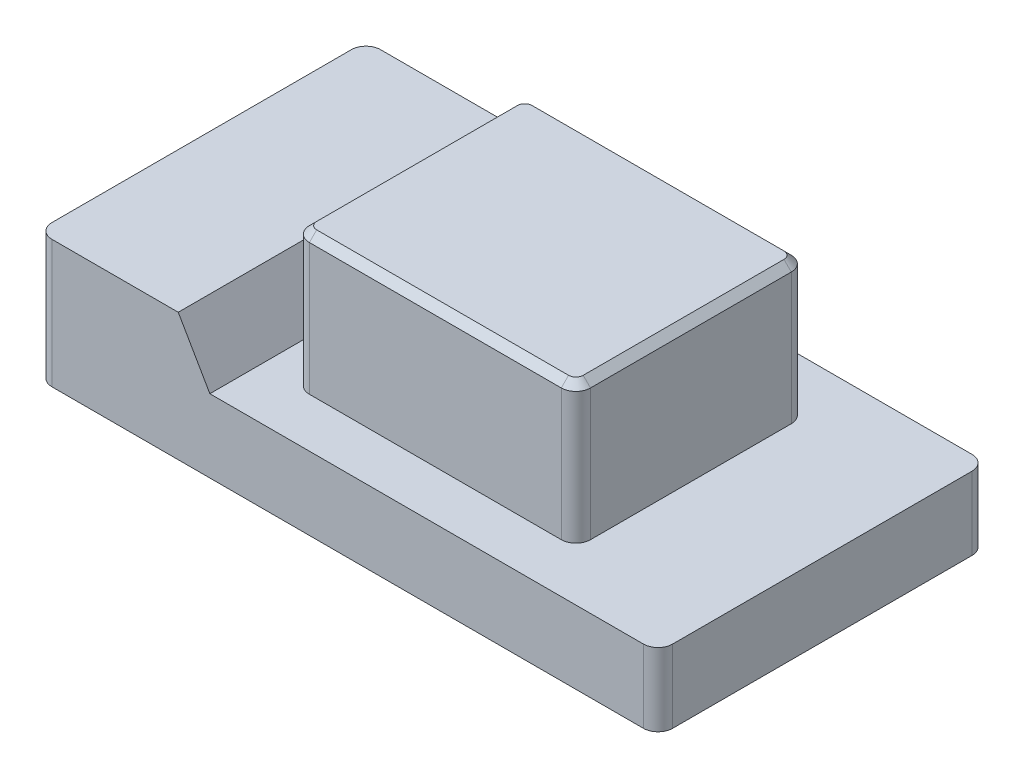
ISO-10303-21;
HEADER;
FILE_DESCRIPTION(('STEP AP214'),'2;1');
FILE_NAME('part.step','',(''),(''),'','','');
FILE_SCHEMA(('AUTOMOTIVE_DESIGN { 1 0 10303 214 1 1 1 1 }'));
ENDSEC;
DATA;
#1=APPLICATION_CONTEXT('core data for automotive mechanical design processes');
#2=APPLICATION_PROTOCOL_DEFINITION('international standard','automotive_design',2000,#1);
#3=PRODUCT_CONTEXT('',#1,'mechanical');
#4=PRODUCT('Part','Part','',(#3));
#5=PRODUCT_RELATED_PRODUCT_CATEGORY('part','',(#4));
#6=PRODUCT_DEFINITION_FORMATION('','',#4);
#7=PRODUCT_DEFINITION_CONTEXT('part definition',#1,'design');
#8=PRODUCT_DEFINITION('design','',#6,#7);
#9=PRODUCT_DEFINITION_SHAPE('','',#8);
#10=(LENGTH_UNIT() NAMED_UNIT(*) SI_UNIT(.MILLI.,.METRE.));
#11=(NAMED_UNIT(*) PLANE_ANGLE_UNIT() SI_UNIT($,.RADIAN.));
#12=(NAMED_UNIT(*) SI_UNIT($,.STERADIAN.) SOLID_ANGLE_UNIT());
#13=UNCERTAINTY_MEASURE_WITH_UNIT(LENGTH_MEASURE(1.E-05),#10,'distance_accuracy_value','');
#14=(GEOMETRIC_REPRESENTATION_CONTEXT(3) GLOBAL_UNCERTAINTY_ASSIGNED_CONTEXT((#13)) GLOBAL_UNIT_ASSIGNED_CONTEXT((#10,
#11,#12)) REPRESENTATION_CONTEXT('',''));
#15=CARTESIAN_POINT('',(0.,0.,0.));
#16=DIRECTION('',(0.,0.,1.));
#17=DIRECTION('',(1.,0.,0.));
#18=AXIS2_PLACEMENT_3D('',#15,#16,#17);
#19=CARTESIAN_POINT('',(0.,10.,0.));
#20=DIRECTION('',(0.,1.,0.));
#21=DIRECTION('',(0.,0.,1.));
#22=AXIS2_PLACEMENT_3D('',#19,#20,#21);
#23=PLANE('',#22);
#24=DIRECTION('',(0.,0.,-1.));
#25=VECTOR('',#24,1.);
#26=CARTESIAN_POINT('',(42.5,10.,22.5));
#27=LINE('',#26,#25);
#28=CARTESIAN_POINT('',(42.5,10.,20.5));
#29=VERTEX_POINT('',#28);
#30=CARTESIAN_POINT('',(42.5,10.,-20.5));
#31=VERTEX_POINT('',#30);
#32=EDGE_CURVE('E221',#29,#31,#27,.T.);
#33=ORIENTED_EDGE('',*,*,#32,.T.);
#34=CARTESIAN_POINT('',(40.5,10.,-20.5));
#35=DIRECTION('',(0.,1.,0.));
#36=DIRECTION('',(0.,0.,1.));
#37=AXIS2_PLACEMENT_3D('',#34,#35,#36);
#38=CIRCLE('',#37,2.);
#39=CARTESIAN_POINT('',(40.5,10.,-22.5));
#40=VERTEX_POINT('',#39);
#41=EDGE_CURVE('E410',#31,#40,#38,.T.);
#42=ORIENTED_EDGE('',*,*,#41,.T.);
#43=DIRECTION('',(-1.,0.,0.));
#44=VECTOR('',#43,1.);
#45=CARTESIAN_POINT('',(42.5,10.,-22.5));
#46=LINE('',#45,#44);
#47=CARTESIAN_POINT('',(-18.8811978464829,10.,-22.5));
#48=VERTEX_POINT('',#47);
#49=EDGE_CURVE('E215',#40,#48,#46,.T.);
#50=ORIENTED_EDGE('',*,*,#49,.T.);
#51=DIRECTION('',(0.,0.,1.));
#52=VECTOR('',#51,1.);
#53=CARTESIAN_POINT('',(-18.8811978464829,10.,0.));
#54=LINE('',#53,#52);
#55=CARTESIAN_POINT('',(-18.8811978464829,10.,22.5));
#56=VERTEX_POINT('',#55);
#57=EDGE_CURVE('E202',#48,#56,#54,.T.);
#58=ORIENTED_EDGE('',*,*,#57,.T.);
#59=DIRECTION('',(1.,0.,0.));
#60=VECTOR('',#59,1.);
#61=CARTESIAN_POINT('',(42.5,10.,22.5));
#62=LINE('',#61,#60);
#63=CARTESIAN_POINT('',(40.5,10.,22.5));
#64=VERTEX_POINT('',#63);
#65=EDGE_CURVE('E212',#56,#64,#62,.T.);
#66=ORIENTED_EDGE('',*,*,#65,.T.);
#67=CARTESIAN_POINT('',(40.5,10.,20.5));
#68=DIRECTION('',(0.,1.,0.));
#69=DIRECTION('',(0.,0.,1.));
#70=AXIS2_PLACEMENT_3D('',#67,#68,#69);
#71=CIRCLE('',#70,2.);
#72=EDGE_CURVE('E407',#64,#29,#71,.T.);
#73=ORIENTED_EDGE('',*,*,#72,.T.);
#74=EDGE_LOOP('',(#33,#42,#50,#58,#66,#73));
#75=FACE_BOUND('',#74,.T.);
#76=DIRECTION('',(1.,0.,0.));
#77=VECTOR('',#76,1.);
#78=CARTESIAN_POINT('',(24.5,10.,15.75));
#79=LINE('',#78,#77);
#80=CARTESIAN_POINT('',(-12.,10.,15.75));
#81=VERTEX_POINT('',#80);
#82=CARTESIAN_POINT('',(22.5,10.,15.75));
#83=VERTEX_POINT('',#82);
#84=EDGE_CURVE('E458',#81,#83,#79,.T.);
#85=ORIENTED_EDGE('',*,*,#84,.F.);
#86=CARTESIAN_POINT('',(-12.,10.,13.75));
#87=DIRECTION('',(0.,1.,0.));
#88=DIRECTION('',(0.,0.,1.));
#89=AXIS2_PLACEMENT_3D('',#86,#87,#88);
#90=CIRCLE('',#89,2.);
#91=CARTESIAN_POINT('',(-14.,10.,13.75));
#92=VERTEX_POINT('',#91);
#93=EDGE_CURVE('E285',#81,#92,#90,.F.);
#94=ORIENTED_EDGE('',*,*,#93,.T.);
#95=DIRECTION('',(0.,0.,1.));
#96=VECTOR('',#95,1.);
#97=CARTESIAN_POINT('',(-14.,10.,15.75));
#98=LINE('',#97,#96);
#99=CARTESIAN_POINT('',(-14.,10.,-13.75));
#100=VERTEX_POINT('',#99);
#101=EDGE_CURVE('E369',#100,#92,#98,.T.);
#102=ORIENTED_EDGE('',*,*,#101,.F.);
#103=CARTESIAN_POINT('',(-12.,10.,-13.75));
#104=DIRECTION('',(0.,1.,0.));
#105=DIRECTION('',(0.,0.,1.));
#106=AXIS2_PLACEMENT_3D('',#103,#104,#105);
#107=CIRCLE('',#106,2.);
#108=CARTESIAN_POINT('',(-12.,10.,-15.75));
#109=VERTEX_POINT('',#108);
#110=EDGE_CURVE('E276',#100,#109,#107,.F.);
#111=ORIENTED_EDGE('',*,*,#110,.T.);
#112=DIRECTION('',(-1.,0.,0.));
#113=VECTOR('',#112,1.);
#114=CARTESIAN_POINT('',(24.5,10.,-15.75));
#115=LINE('',#114,#113);
#116=CARTESIAN_POINT('',(22.5,10.,-15.75));
#117=VERTEX_POINT('',#116);
#118=EDGE_CURVE('E447',#117,#109,#115,.T.);
#119=ORIENTED_EDGE('',*,*,#118,.F.);
#120=CARTESIAN_POINT('',(22.5,10.,-13.75));
#121=DIRECTION('',(0.,1.,0.));
#122=DIRECTION('',(0.,0.,1.));
#123=AXIS2_PLACEMENT_3D('',#120,#121,#122);
#124=CIRCLE('',#123,2.);
#125=CARTESIAN_POINT('',(24.5,10.,-13.75));
#126=VERTEX_POINT('',#125);
#127=EDGE_CURVE('E279',#117,#126,#124,.F.);
#128=ORIENTED_EDGE('',*,*,#127,.T.);
#129=DIRECTION('',(0.,0.,-1.));
#130=VECTOR('',#129,1.);
#131=CARTESIAN_POINT('',(24.5,10.,15.75));
#132=LINE('',#131,#130);
#133=CARTESIAN_POINT('',(24.5,10.,13.75));
#134=VERTEX_POINT('',#133);
#135=EDGE_CURVE('E452',#134,#126,#132,.T.);
#136=ORIENTED_EDGE('',*,*,#135,.F.);
#137=CARTESIAN_POINT('',(22.5,10.,13.75));
#138=DIRECTION('',(0.,1.,0.));
#139=DIRECTION('',(0.,0.,1.));
#140=AXIS2_PLACEMENT_3D('',#137,#138,#139);
#141=CIRCLE('',#140,2.);
#142=EDGE_CURVE('E282',#134,#83,#141,.F.);
#143=ORIENTED_EDGE('',*,*,#142,.T.);
#144=EDGE_LOOP('',(#85,#94,#102,#111,#119,#128,#136,#143));
#145=FACE_BOUND('',#144,.T.);
#146=ADVANCED_FACE('F45',(#75,#145),#23,.T.);
#147=CARTESIAN_POINT('',(-42.5,10.,22.5));
#148=DIRECTION('',(1.,0.,0.));
#149=DIRECTION('',(0.,0.,-1.));
#150=AXIS2_PLACEMENT_3D('',#147,#148,#149);
#151=PLANE('',#150);
#152=DIRECTION('',(0.,0.,1.));
#153=VECTOR('',#152,1.);
#154=CARTESIAN_POINT('',(-42.5,17.5,-22.5));
#155=LINE('',#154,#153);
#156=CARTESIAN_POINT('',(-42.5,17.5,-20.5));
#157=VERTEX_POINT('',#156);
#158=CARTESIAN_POINT('',(-42.5,17.5,20.5));
#159=VERTEX_POINT('',#158);
#160=EDGE_CURVE('E444',#157,#159,#155,.T.);
#161=ORIENTED_EDGE('',*,*,#160,.F.);
#162=DIRECTION('',(0.,-1.,0.));
#163=VECTOR('',#162,1.);
#164=CARTESIAN_POINT('',(-42.5,10.,-20.5));
#165=LINE('',#164,#163);
#166=CARTESIAN_POINT('',(-42.5,0.,-20.5));
#167=VERTEX_POINT('',#166);
#168=EDGE_CURVE('E372',#157,#167,#165,.T.);
#169=ORIENTED_EDGE('',*,*,#168,.T.);
#170=DIRECTION('',(0.,0.,1.));
#171=VECTOR('',#170,1.);
#172=CARTESIAN_POINT('',(-42.5,0.,22.5));
#173=LINE('',#172,#171);
#174=CARTESIAN_POINT('',(-42.5,0.,20.5));
#175=VERTEX_POINT('',#174);
#176=EDGE_CURVE('E236',#167,#175,#173,.T.);
#177=ORIENTED_EDGE('',*,*,#176,.T.);
#178=DIRECTION('',(0.,-1.,0.));
#179=VECTOR('',#178,1.);
#180=CARTESIAN_POINT('',(-42.5,10.,20.5));
#181=LINE('',#180,#179);
#182=EDGE_CURVE('E338',#175,#159,#181,.F.);
#183=ORIENTED_EDGE('',*,*,#182,.T.);
#184=EDGE_LOOP('',(#161,#169,#177,#183));
#185=FACE_BOUND('',#184,.T.);
#186=ADVANCED_FACE('F441',(#185),#151,.F.);
#187=CARTESIAN_POINT('',(42.5,10.,22.5));
#188=DIRECTION('',(0.,0.,-1.));
#189=DIRECTION('',(-1.,0.,0.));
#190=AXIS2_PLACEMENT_3D('',#187,#188,#189);
#191=PLANE('',#190);
#192=DIRECTION('',(1.,0.,0.));
#193=VECTOR('',#192,1.);
#194=CARTESIAN_POINT('',(42.5,0.,22.5));
#195=LINE('',#194,#193);
#196=CARTESIAN_POINT('',(-40.5,0.,22.5));
#197=VERTEX_POINT('',#196);
#198=CARTESIAN_POINT('',(40.5,0.,22.5));
#199=VERTEX_POINT('',#198);
#200=EDGE_CURVE('E240',#197,#199,#195,.T.);
#201=ORIENTED_EDGE('',*,*,#200,.T.);
#202=DIRECTION('',(0.,-1.,0.));
#203=VECTOR('',#202,1.);
#204=CARTESIAN_POINT('',(40.5,10.,22.5));
#205=LINE('',#204,#203);
#206=EDGE_CURVE('E11',#199,#64,#205,.F.);
#207=ORIENTED_EDGE('',*,*,#206,.T.);
#208=ORIENTED_EDGE('',*,*,#65,.F.);
#209=DIRECTION('',(-0.500000000000005,0.866025403784435,0.));
#210=VECTOR('',#209,1.);
#211=CARTESIAN_POINT('',(-3.53589838486185,-16.5788383248866,22.5));
#212=LINE('',#211,#210);
#213=CARTESIAN_POINT('',(-23.2113248654051,17.5,22.5));
#214=VERTEX_POINT('',#213);
#215=EDGE_CURVE('E198',#56,#214,#212,.T.);
#216=ORIENTED_EDGE('',*,*,#215,.T.);
#217=DIRECTION('',(1.,0.,0.));
#218=VECTOR('',#217,1.);
#219=CARTESIAN_POINT('',(-42.5,17.5,22.5));
#220=LINE('',#219,#218);
#221=CARTESIAN_POINT('',(-40.5,17.5,22.5));
#222=VERTEX_POINT('',#221);
#223=EDGE_CURVE('E416',#222,#214,#220,.T.);
#224=ORIENTED_EDGE('',*,*,#223,.F.);
#225=DIRECTION('',(0.,-1.,0.));
#226=VECTOR('',#225,1.);
#227=CARTESIAN_POINT('',(-40.5,10.,22.5));
#228=LINE('',#227,#226);
#229=EDGE_CURVE('E54',#222,#197,#228,.T.);
#230=ORIENTED_EDGE('',*,*,#229,.T.);
#231=EDGE_LOOP('',(#201,#207,#208,#216,#224,#230));
#232=FACE_BOUND('',#231,.T.);
#233=ADVANCED_FACE('F219',(#232),#191,.F.);
#234=CARTESIAN_POINT('',(42.5,10.,22.5));
#235=DIRECTION('',(-1.,0.,0.));
#236=DIRECTION('',(0.,0.,1.));
#237=AXIS2_PLACEMENT_3D('',#234,#235,#236);
#238=PLANE('',#237);
#239=DIRECTION('',(0.,0.,-1.));
#240=VECTOR('',#239,1.);
#241=CARTESIAN_POINT('',(42.5,0.,22.5));
#242=LINE('',#241,#240);
#243=CARTESIAN_POINT('',(42.5,0.,20.5));
#244=VERTEX_POINT('',#243);
#245=CARTESIAN_POINT('',(42.5,0.,-20.5));
#246=VERTEX_POINT('',#245);
#247=EDGE_CURVE('E228',#244,#246,#242,.T.);
#248=ORIENTED_EDGE('',*,*,#247,.T.);
#249=DIRECTION('',(0.,-1.,0.));
#250=VECTOR('',#249,1.);
#251=CARTESIAN_POINT('',(42.5,10.,-20.5));
#252=LINE('',#251,#250);
#253=EDGE_CURVE('E67',#246,#31,#252,.F.);
#254=ORIENTED_EDGE('',*,*,#253,.T.);
#255=ORIENTED_EDGE('',*,*,#32,.F.);
#256=DIRECTION('',(0.,-1.,0.));
#257=VECTOR('',#256,1.);
#258=CARTESIAN_POINT('',(42.5,10.,20.5));
#259=LINE('',#258,#257);
#260=EDGE_CURVE('E401',#29,#244,#259,.T.);
#261=ORIENTED_EDGE('',*,*,#260,.T.);
#262=EDGE_LOOP('',(#248,#254,#255,#261));
#263=FACE_BOUND('',#262,.T.);
#264=ADVANCED_FACE('F426',(#263),#238,.F.);
#265=CARTESIAN_POINT('',(42.5,10.,-22.5));
#266=DIRECTION('',(0.,0.,1.));
#267=DIRECTION('',(1.,0.,0.));
#268=AXIS2_PLACEMENT_3D('',#265,#266,#267);
#269=PLANE('',#268);
#270=DIRECTION('',(-1.,0.,0.));
#271=VECTOR('',#270,1.);
#272=CARTESIAN_POINT('',(42.5,0.,-22.5));
#273=LINE('',#272,#271);
#274=CARTESIAN_POINT('',(40.5,0.,-22.5));
#275=VERTEX_POINT('',#274);
#276=CARTESIAN_POINT('',(-40.5,0.,-22.5));
#277=VERTEX_POINT('',#276);
#278=EDGE_CURVE('E222',#275,#277,#273,.T.);
#279=ORIENTED_EDGE('',*,*,#278,.T.);
#280=DIRECTION('',(0.,-1.,0.));
#281=VECTOR('',#280,1.);
#282=CARTESIAN_POINT('',(-40.5,10.,-22.5));
#283=LINE('',#282,#281);
#284=CARTESIAN_POINT('',(-40.5,17.5,-22.5));
#285=VERTEX_POINT('',#284);
#286=EDGE_CURVE('E392',#277,#285,#283,.F.);
#287=ORIENTED_EDGE('',*,*,#286,.T.);
#288=DIRECTION('',(-1.,0.,0.));
#289=VECTOR('',#288,1.);
#290=CARTESIAN_POINT('',(-42.5,17.5,-22.5));
#291=LINE('',#290,#289);
#292=CARTESIAN_POINT('',(-23.2113248654052,17.5,-22.5));
#293=VERTEX_POINT('',#292);
#294=EDGE_CURVE('E231',#293,#285,#291,.T.);
#295=ORIENTED_EDGE('',*,*,#294,.F.);
#296=DIRECTION('',(0.500000000000005,-0.866025403784435,0.));
#297=VECTOR('',#296,1.);
#298=CARTESIAN_POINT('',(-3.53589838486185,-16.5788383248866,-22.5));
#299=LINE('',#298,#297);
#300=EDGE_CURVE('E208',#293,#48,#299,.T.);
#301=ORIENTED_EDGE('',*,*,#300,.T.);
#302=ORIENTED_EDGE('',*,*,#49,.F.);
#303=DIRECTION('',(0.,-1.,0.));
#304=VECTOR('',#303,1.);
#305=CARTESIAN_POINT('',(40.5,10.,-22.5));
#306=LINE('',#305,#304);
#307=EDGE_CURVE('E388',#40,#275,#306,.T.);
#308=ORIENTED_EDGE('',*,*,#307,.T.);
#309=EDGE_LOOP('',(#279,#287,#295,#301,#302,#308));
#310=FACE_BOUND('',#309,.T.);
#311=ADVANCED_FACE('F433',(#310),#269,.F.);
#312=CARTESIAN_POINT('',(0.,0.,0.));
#313=DIRECTION('',(0.,1.,0.));
#314=DIRECTION('',(0.,0.,1.));
#315=AXIS2_PLACEMENT_3D('',#312,#313,#314);
#316=PLANE('',#315);
#317=ORIENTED_EDGE('',*,*,#176,.F.);
#318=CARTESIAN_POINT('',(-40.5,0.,-20.5));
#319=DIRECTION('',(0.,1.,0.));
#320=DIRECTION('',(0.,0.,1.));
#321=AXIS2_PLACEMENT_3D('',#318,#319,#320);
#322=CIRCLE('',#321,2.);
#323=EDGE_CURVE('E385',#167,#277,#322,.F.);
#324=ORIENTED_EDGE('',*,*,#323,.T.);
#325=ORIENTED_EDGE('',*,*,#278,.F.);
#326=CARTESIAN_POINT('',(40.5,0.,-20.5));
#327=DIRECTION('',(0.,1.,0.));
#328=DIRECTION('',(0.,0.,1.));
#329=AXIS2_PLACEMENT_3D('',#326,#327,#328);
#330=CIRCLE('',#329,2.);
#331=EDGE_CURVE('E382',#275,#246,#330,.F.);
#332=ORIENTED_EDGE('',*,*,#331,.T.);
#333=ORIENTED_EDGE('',*,*,#247,.F.);
#334=CARTESIAN_POINT('',(40.5,0.,20.5));
#335=DIRECTION('',(0.,1.,0.));
#336=DIRECTION('',(0.,0.,1.));
#337=AXIS2_PLACEMENT_3D('',#334,#335,#336);
#338=CIRCLE('',#337,2.);
#339=EDGE_CURVE('E379',#244,#199,#338,.F.);
#340=ORIENTED_EDGE('',*,*,#339,.T.);
#341=ORIENTED_EDGE('',*,*,#200,.F.);
#342=CARTESIAN_POINT('',(-40.5,0.,20.5));
#343=DIRECTION('',(0.,1.,0.));
#344=DIRECTION('',(0.,0.,1.));
#345=AXIS2_PLACEMENT_3D('',#342,#343,#344);
#346=CIRCLE('',#345,2.);
#347=EDGE_CURVE('E376',#197,#175,#346,.F.);
#348=ORIENTED_EDGE('',*,*,#347,.T.);
#349=EDGE_LOOP('',(#317,#324,#325,#332,#333,#340,#341,#348));
#350=FACE_BOUND('',#349,.T.);
#351=ADVANCED_FACE('F421',(#350),#316,.F.);
#352=CARTESIAN_POINT('',(0.,17.5,0.));
#353=DIRECTION('',(0.,1.,0.));
#354=DIRECTION('',(0.,0.,1.));
#355=AXIS2_PLACEMENT_3D('',#352,#353,#354);
#356=PLANE('',#355);
#357=ORIENTED_EDGE('',*,*,#294,.T.);
#358=CARTESIAN_POINT('',(-40.5,17.5,-20.5));
#359=DIRECTION('',(0.,1.,0.));
#360=DIRECTION('',(0.,0.,1.));
#361=AXIS2_PLACEMENT_3D('',#358,#359,#360);
#362=CIRCLE('',#361,2.);
#363=EDGE_CURVE('E398',#285,#157,#362,.T.);
#364=ORIENTED_EDGE('',*,*,#363,.T.);
#365=ORIENTED_EDGE('',*,*,#160,.T.);
#366=CARTESIAN_POINT('',(-40.5,17.5,20.5));
#367=DIRECTION('',(0.,1.,0.));
#368=DIRECTION('',(0.,0.,1.));
#369=AXIS2_PLACEMENT_3D('',#366,#367,#368);
#370=CIRCLE('',#369,2.);
#371=EDGE_CURVE('E395',#159,#222,#370,.T.);
#372=ORIENTED_EDGE('',*,*,#371,.T.);
#373=ORIENTED_EDGE('',*,*,#223,.T.);
#374=DIRECTION('',(0.,0.,-1.));
#375=VECTOR('',#374,1.);
#376=CARTESIAN_POINT('',(-23.2113248654052,17.5,-22.5));
#377=LINE('',#376,#375);
#378=EDGE_CURVE('E204',#214,#293,#377,.T.);
#379=ORIENTED_EDGE('',*,*,#378,.T.);
#380=EDGE_LOOP('',(#357,#364,#365,#372,#373,#379));
#381=FACE_BOUND('',#380,.T.);
#382=ADVANCED_FACE('F555',(#381),#356,.T.);
#383=CARTESIAN_POINT('',(-23.5,18.,-22.5));
#384=DIRECTION('',(-0.866025403784436,-0.500000000000005,0.));
#385=DIRECTION('',(0.,0.,-1.));
#386=AXIS2_PLACEMENT_3D('',#383,#384,#385);
#387=PLANE('',#386);
#388=ORIENTED_EDGE('',*,*,#215,.F.);
#389=ORIENTED_EDGE('',*,*,#57,.F.);
#390=ORIENTED_EDGE('',*,*,#300,.F.);
#391=ORIENTED_EDGE('',*,*,#378,.F.);
#392=EDGE_LOOP('',(#388,#389,#390,#391));
#393=FACE_BOUND('',#392,.T.);
#394=ADVANCED_FACE('F200',(#393),#387,.F.);
#395=CARTESIAN_POINT('',(-14.,29.,15.75));
#396=DIRECTION('',(1.,0.,0.));
#397=DIRECTION('',(0.,0.,-1.));
#398=AXIS2_PLACEMENT_3D('',#395,#396,#397);
#399=PLANE('',#398);
#400=DIRECTION('',(0.,-1.,0.));
#401=VECTOR('',#400,1.);
#402=CARTESIAN_POINT('',(-14.,29.,13.75));
#403=LINE('',#402,#401);
#404=CARTESIAN_POINT('',(-14.,28.,13.75));
#405=VERTEX_POINT('',#404);
#406=EDGE_CURVE('E207',#92,#405,#403,.F.);
#407=ORIENTED_EDGE('',*,*,#406,.T.);
#408=DIRECTION('',(0.,0.,-1.));
#409=VECTOR('',#408,1.);
#410=CARTESIAN_POINT('',(-14.,28.,-13.75));
#411=LINE('',#410,#409);
#412=CARTESIAN_POINT('',(-14.,28.,-13.75));
#413=VERTEX_POINT('',#412);
#414=EDGE_CURVE('E323',#405,#413,#411,.T.);
#415=ORIENTED_EDGE('',*,*,#414,.T.);
#416=DIRECTION('',(0.,-1.,0.));
#417=VECTOR('',#416,1.);
#418=CARTESIAN_POINT('',(-14.,29.,-13.75));
#419=LINE('',#418,#417);
#420=EDGE_CURVE('E252',#413,#100,#419,.T.);
#421=ORIENTED_EDGE('',*,*,#420,.T.);
#422=ORIENTED_EDGE('',*,*,#101,.T.);
#423=EDGE_LOOP('',(#407,#415,#421,#422));
#424=FACE_BOUND('',#423,.T.);
#425=ADVANCED_FACE('F467',(#424),#399,.F.);
#426=CARTESIAN_POINT('',(24.5,29.,15.75));
#427=DIRECTION('',(0.,0.,-1.));
#428=DIRECTION('',(-1.,0.,0.));
#429=AXIS2_PLACEMENT_3D('',#426,#427,#428);
#430=PLANE('',#429);
#431=DIRECTION('',(0.,-1.,0.));
#432=VECTOR('',#431,1.);
#433=CARTESIAN_POINT('',(22.5,29.,15.75));
#434=LINE('',#433,#432);
#435=CARTESIAN_POINT('',(22.5,28.,15.75));
#436=VERTEX_POINT('',#435);
#437=EDGE_CURVE('E272',#83,#436,#434,.F.);
#438=ORIENTED_EDGE('',*,*,#437,.T.);
#439=DIRECTION('',(-1.,0.,0.));
#440=VECTOR('',#439,1.);
#441=CARTESIAN_POINT('',(-12.,28.,15.75));
#442=LINE('',#441,#440);
#443=CARTESIAN_POINT('',(-12.,28.,15.75));
#444=VERTEX_POINT('',#443);
#445=EDGE_CURVE('E335',#436,#444,#442,.T.);
#446=ORIENTED_EDGE('',*,*,#445,.T.);
#447=DIRECTION('',(0.,-1.,0.));
#448=VECTOR('',#447,1.);
#449=CARTESIAN_POINT('',(-12.,29.,15.75));
#450=LINE('',#449,#448);
#451=EDGE_CURVE('E269',#444,#81,#450,.T.);
#452=ORIENTED_EDGE('',*,*,#451,.T.);
#453=ORIENTED_EDGE('',*,*,#84,.T.);
#454=EDGE_LOOP('',(#438,#446,#452,#453));
#455=FACE_BOUND('',#454,.T.);
#456=ADVANCED_FACE('F510',(#455),#430,.F.);
#457=CARTESIAN_POINT('',(24.5,29.,15.75));
#458=DIRECTION('',(-1.,0.,0.));
#459=DIRECTION('',(0.,0.,1.));
#460=AXIS2_PLACEMENT_3D('',#457,#458,#459);
#461=PLANE('',#460);
#462=DIRECTION('',(0.,-1.,0.));
#463=VECTOR('',#462,1.);
#464=CARTESIAN_POINT('',(24.5,29.,-13.75));
#465=LINE('',#464,#463);
#466=CARTESIAN_POINT('',(24.5,28.,-13.75));
#467=VERTEX_POINT('',#466);
#468=EDGE_CURVE('E265',#126,#467,#465,.F.);
#469=ORIENTED_EDGE('',*,*,#468,.T.);
#470=DIRECTION('',(0.,0.,1.));
#471=VECTOR('',#470,1.);
#472=CARTESIAN_POINT('',(24.5,28.,13.75));
#473=LINE('',#472,#471);
#474=CARTESIAN_POINT('',(24.5,28.,13.75));
#475=VERTEX_POINT('',#474);
#476=EDGE_CURVE('E326',#467,#475,#473,.T.);
#477=ORIENTED_EDGE('',*,*,#476,.T.);
#478=DIRECTION('',(0.,-1.,0.));
#479=VECTOR('',#478,1.);
#480=CARTESIAN_POINT('',(24.5,29.,13.75));
#481=LINE('',#480,#479);
#482=EDGE_CURVE('E262',#475,#134,#481,.T.);
#483=ORIENTED_EDGE('',*,*,#482,.T.);
#484=ORIENTED_EDGE('',*,*,#135,.T.);
#485=EDGE_LOOP('',(#469,#477,#483,#484));
#486=FACE_BOUND('',#485,.T.);
#487=ADVANCED_FACE('F501',(#486),#461,.F.);
#488=CARTESIAN_POINT('',(24.5,29.,-15.75));
#489=DIRECTION('',(0.,0.,1.));
#490=DIRECTION('',(1.,0.,0.));
#491=AXIS2_PLACEMENT_3D('',#488,#489,#490);
#492=PLANE('',#491);
#493=DIRECTION('',(0.,-1.,0.));
#494=VECTOR('',#493,1.);
#495=CARTESIAN_POINT('',(-12.,29.,-15.75));
#496=LINE('',#495,#494);
#497=CARTESIAN_POINT('',(-12.,28.,-15.75));
#498=VERTEX_POINT('',#497);
#499=EDGE_CURVE('E258',#109,#498,#496,.F.);
#500=ORIENTED_EDGE('',*,*,#499,.T.);
#501=DIRECTION('',(1.,0.,0.));
#502=VECTOR('',#501,1.);
#503=CARTESIAN_POINT('',(22.5,28.,-15.75));
#504=LINE('',#503,#502);
#505=CARTESIAN_POINT('',(22.5,28.,-15.75));
#506=VERTEX_POINT('',#505);
#507=EDGE_CURVE('E313',#498,#506,#504,.T.);
#508=ORIENTED_EDGE('',*,*,#507,.T.);
#509=DIRECTION('',(0.,-1.,0.));
#510=VECTOR('',#509,1.);
#511=CARTESIAN_POINT('',(22.5,29.,-15.75));
#512=LINE('',#511,#510);
#513=EDGE_CURVE('E255',#506,#117,#512,.T.);
#514=ORIENTED_EDGE('',*,*,#513,.T.);
#515=ORIENTED_EDGE('',*,*,#118,.T.);
#516=EDGE_LOOP('',(#500,#508,#514,#515));
#517=FACE_BOUND('',#516,.T.);
#518=ADVANCED_FACE('F492',(#517),#492,.F.);
#519=CARTESIAN_POINT('',(0.,29.,0.));
#520=DIRECTION('',(0.,1.,0.));
#521=DIRECTION('',(0.,0.,1.));
#522=AXIS2_PLACEMENT_3D('',#519,#520,#521);
#523=PLANE('',#522);
#524=CARTESIAN_POINT('',(22.5,29.,-13.75));
#525=DIRECTION('',(0.,1.,0.));
#526=DIRECTION('',(0.,0.,1.));
#527=AXIS2_PLACEMENT_3D('',#524,#525,#526);
#528=CIRCLE('',#527,0.999999999999997);
#529=CARTESIAN_POINT('',(23.5,29.,-13.75));
#530=VERTEX_POINT('',#529);
#531=CARTESIAN_POINT('',(22.5,29.,-14.75));
#532=VERTEX_POINT('',#531);
#533=EDGE_CURVE('E303',#530,#532,#528,.T.);
#534=ORIENTED_EDGE('',*,*,#533,.T.);
#535=DIRECTION('',(-1.,0.,0.));
#536=VECTOR('',#535,1.);
#537=CARTESIAN_POINT('',(-12.,29.,-14.75));
#538=LINE('',#537,#536);
#539=CARTESIAN_POINT('',(-12.,29.,-14.75));
#540=VERTEX_POINT('',#539);
#541=EDGE_CURVE('E309',#532,#540,#538,.T.);
#542=ORIENTED_EDGE('',*,*,#541,.T.);
#543=CARTESIAN_POINT('',(-12.,29.,-13.75));
#544=DIRECTION('',(0.,1.,0.));
#545=DIRECTION('',(0.,0.,1.));
#546=AXIS2_PLACEMENT_3D('',#543,#544,#545);
#547=CIRCLE('',#546,0.999999999999999);
#548=CARTESIAN_POINT('',(-13.,29.,-13.75));
#549=VERTEX_POINT('',#548);
#550=EDGE_CURVE('E306',#540,#549,#547,.T.);
#551=ORIENTED_EDGE('',*,*,#550,.T.);
#552=DIRECTION('',(0.,0.,1.));
#553=VECTOR('',#552,1.);
#554=CARTESIAN_POINT('',(-13.,29.,13.75));
#555=LINE('',#554,#553);
#556=CARTESIAN_POINT('',(-13.,29.,13.75));
#557=VERTEX_POINT('',#556);
#558=EDGE_CURVE('E300',#549,#557,#555,.T.);
#559=ORIENTED_EDGE('',*,*,#558,.T.);
#560=CARTESIAN_POINT('',(-12.,29.,13.75));
#561=DIRECTION('',(0.,1.,0.));
#562=DIRECTION('',(0.,0.,1.));
#563=AXIS2_PLACEMENT_3D('',#560,#561,#562);
#564=CIRCLE('',#563,0.999999999999999);
#565=CARTESIAN_POINT('',(-12.,29.,14.75));
#566=VERTEX_POINT('',#565);
#567=EDGE_CURVE('E294',#557,#566,#564,.T.);
#568=ORIENTED_EDGE('',*,*,#567,.T.);
#569=DIRECTION('',(1.,0.,0.));
#570=VECTOR('',#569,1.);
#571=CARTESIAN_POINT('',(22.5,29.,14.75));
#572=LINE('',#571,#570);
#573=CARTESIAN_POINT('',(22.5,29.,14.75));
#574=VERTEX_POINT('',#573);
#575=EDGE_CURVE('E288',#566,#574,#572,.T.);
#576=ORIENTED_EDGE('',*,*,#575,.T.);
#577=CARTESIAN_POINT('',(22.5,29.,13.75));
#578=DIRECTION('',(0.,1.,0.));
#579=DIRECTION('',(0.,0.,1.));
#580=AXIS2_PLACEMENT_3D('',#577,#578,#579);
#581=CIRCLE('',#580,0.999999999999997);
#582=CARTESIAN_POINT('',(23.5,29.,13.75));
#583=VERTEX_POINT('',#582);
#584=EDGE_CURVE('E291',#574,#583,#581,.T.);
#585=ORIENTED_EDGE('',*,*,#584,.T.);
#586=DIRECTION('',(0.,0.,-1.));
#587=VECTOR('',#586,1.);
#588=CARTESIAN_POINT('',(23.5,29.,-13.75));
#589=LINE('',#588,#587);
#590=EDGE_CURVE('E297',#583,#530,#589,.T.);
#591=ORIENTED_EDGE('',*,*,#590,.T.);
#592=EDGE_LOOP('',(#534,#542,#551,#559,#568,#576,#585,#591));
#593=FACE_BOUND('',#592,.T.);
#594=ADVANCED_FACE('F522',(#593),#523,.T.);
#595=CARTESIAN_POINT('',(-12.,29.,-13.75));
#596=DIRECTION('',(0.,-1.,0.));
#597=DIRECTION('',(0.,0.,-1.));
#598=AXIS2_PLACEMENT_3D('',#595,#596,#597);
#599=CYLINDRICAL_SURFACE('',#598,2.);
#600=ORIENTED_EDGE('',*,*,#420,.F.);
#601=CARTESIAN_POINT('',(-12.,28.,-13.75));
#602=DIRECTION('',(0.,1.,0.));
#603=DIRECTION('',(0.,0.,1.));
#604=AXIS2_PLACEMENT_3D('',#601,#602,#603);
#605=CIRCLE('',#604,2.);
#606=EDGE_CURVE('E317',#413,#498,#605,.F.);
#607=ORIENTED_EDGE('',*,*,#606,.T.);
#608=ORIENTED_EDGE('',*,*,#499,.F.);
#609=ORIENTED_EDGE('',*,*,#110,.F.);
#610=EDGE_LOOP('',(#600,#607,#608,#609));
#611=FACE_BOUND('',#610,.T.);
#612=ADVANCED_FACE('F488',(#611),#599,.T.);
#613=CARTESIAN_POINT('',(22.5,29.,-13.75));
#614=DIRECTION('',(0.,-1.,0.));
#615=DIRECTION('',(0.,0.,-1.));
#616=AXIS2_PLACEMENT_3D('',#613,#614,#615);
#617=CYLINDRICAL_SURFACE('',#616,2.);
#618=ORIENTED_EDGE('',*,*,#513,.F.);
#619=CARTESIAN_POINT('',(22.5,28.,-13.75));
#620=DIRECTION('',(0.,1.,0.));
#621=DIRECTION('',(0.,0.,1.));
#622=AXIS2_PLACEMENT_3D('',#619,#620,#621);
#623=CIRCLE('',#622,2.);
#624=EDGE_CURVE('E320',#506,#467,#623,.F.);
#625=ORIENTED_EDGE('',*,*,#624,.T.);
#626=ORIENTED_EDGE('',*,*,#468,.F.);
#627=ORIENTED_EDGE('',*,*,#127,.F.);
#628=EDGE_LOOP('',(#618,#625,#626,#627));
#629=FACE_BOUND('',#628,.T.);
#630=ADVANCED_FACE('F498',(#629),#617,.T.);
#631=CARTESIAN_POINT('',(22.5,29.,13.75));
#632=DIRECTION('',(0.,-1.,0.));
#633=DIRECTION('',(0.,0.,-1.));
#634=AXIS2_PLACEMENT_3D('',#631,#632,#633);
#635=CYLINDRICAL_SURFACE('',#634,2.);
#636=ORIENTED_EDGE('',*,*,#482,.F.);
#637=CARTESIAN_POINT('',(22.5,28.,13.75));
#638=DIRECTION('',(0.,1.,0.));
#639=DIRECTION('',(0.,0.,1.));
#640=AXIS2_PLACEMENT_3D('',#637,#638,#639);
#641=CIRCLE('',#640,2.);
#642=EDGE_CURVE('E332',#475,#436,#641,.F.);
#643=ORIENTED_EDGE('',*,*,#642,.T.);
#644=ORIENTED_EDGE('',*,*,#437,.F.);
#645=ORIENTED_EDGE('',*,*,#142,.F.);
#646=EDGE_LOOP('',(#636,#643,#644,#645));
#647=FACE_BOUND('',#646,.T.);
#648=ADVANCED_FACE('F508',(#647),#635,.T.);
#649=CARTESIAN_POINT('',(-12.,29.,13.75));
#650=DIRECTION('',(0.,-1.,0.));
#651=DIRECTION('',(0.,0.,-1.));
#652=AXIS2_PLACEMENT_3D('',#649,#650,#651);
#653=CYLINDRICAL_SURFACE('',#652,2.);
#654=ORIENTED_EDGE('',*,*,#451,.F.);
#655=CARTESIAN_POINT('',(-12.,28.,13.75));
#656=DIRECTION('',(0.,1.,0.));
#657=DIRECTION('',(0.,0.,1.));
#658=AXIS2_PLACEMENT_3D('',#655,#656,#657);
#659=CIRCLE('',#658,2.);
#660=EDGE_CURVE('E329',#444,#405,#659,.F.);
#661=ORIENTED_EDGE('',*,*,#660,.T.);
#662=ORIENTED_EDGE('',*,*,#406,.F.);
#663=ORIENTED_EDGE('',*,*,#93,.F.);
#664=EDGE_LOOP('',(#654,#661,#662,#663));
#665=FACE_BOUND('',#664,.T.);
#666=ADVANCED_FACE('F474',(#665),#653,.T.);
#667=CARTESIAN_POINT('',(0.,29.,14.75));
#668=DIRECTION('',(0.,0.707106781186548,0.707106781186547));
#669=DIRECTION('',(-1.,0.,0.));
#670=AXIS2_PLACEMENT_3D('',#667,#668,#669);
#671=PLANE('',#670);
#672=DIRECTION('',(0.,0.707106781186547,-0.707106781186547));
#673=VECTOR('',#672,1.);
#674=CARTESIAN_POINT('',(-12.,28.,15.75));
#675=LINE('',#674,#673);
#676=EDGE_CURVE('E361',#444,#566,#675,.T.);
#677=ORIENTED_EDGE('',*,*,#676,.F.);
#678=ORIENTED_EDGE('',*,*,#445,.F.);
#679=DIRECTION('',(0.,-0.707106781186547,0.707106781186547));
#680=VECTOR('',#679,1.);
#681=CARTESIAN_POINT('',(22.5,29.,14.75));
#682=LINE('',#681,#680);
#683=EDGE_CURVE('E365',#574,#436,#682,.T.);
#684=ORIENTED_EDGE('',*,*,#683,.F.);
#685=ORIENTED_EDGE('',*,*,#575,.F.);
#686=EDGE_LOOP('',(#677,#678,#684,#685));
#687=FACE_BOUND('',#686,.T.);
#688=ADVANCED_FACE('F514',(#687),#671,.T.);
#689=CARTESIAN_POINT('',(22.5,29.,13.75));
#690=DIRECTION('',(0.,-1.,0.));
#691=DIRECTION('',(0.,0.,-1.));
#692=AXIS2_PLACEMENT_3D('',#689,#690,#691);
#693=CONICAL_SURFACE('',#692,0.999999999999999,0.785398163397448);
#694=ORIENTED_EDGE('',*,*,#683,.T.);
#695=ORIENTED_EDGE('',*,*,#642,.F.);
#696=DIRECTION('',(0.707106781186547,-0.707106781186547,0.));
#697=VECTOR('',#696,1.);
#698=CARTESIAN_POINT('',(23.5,29.,13.75));
#699=LINE('',#698,#697);
#700=EDGE_CURVE('E357',#583,#475,#699,.T.);
#701=ORIENTED_EDGE('',*,*,#700,.F.);
#702=ORIENTED_EDGE('',*,*,#584,.F.);
#703=EDGE_LOOP('',(#694,#695,#701,#702));
#704=FACE_BOUND('',#703,.T.);
#705=ADVANCED_FACE('F518',(#704),#693,.T.);
#706=CARTESIAN_POINT('',(-12.,29.,13.75));
#707=DIRECTION('',(0.,-1.,0.));
#708=DIRECTION('',(0.,0.,-1.));
#709=AXIS2_PLACEMENT_3D('',#706,#707,#708);
#710=CONICAL_SURFACE('',#709,0.999999999999999,0.785398163397448);
#711=ORIENTED_EDGE('',*,*,#676,.T.);
#712=ORIENTED_EDGE('',*,*,#567,.F.);
#713=DIRECTION('',(0.707106781186547,0.707106781186547,0.));
#714=VECTOR('',#713,1.);
#715=CARTESIAN_POINT('',(-14.,28.,13.75));
#716=LINE('',#715,#714);
#717=EDGE_CURVE('E353',#405,#557,#716,.T.);
#718=ORIENTED_EDGE('',*,*,#717,.F.);
#719=ORIENTED_EDGE('',*,*,#660,.F.);
#720=EDGE_LOOP('',(#711,#712,#718,#719));
#721=FACE_BOUND('',#720,.T.);
#722=ADVANCED_FACE('F479',(#721),#710,.T.);
#723=CARTESIAN_POINT('',(23.5,29.,0.));
#724=DIRECTION('',(0.707106781186547,0.707106781186547,0.));
#725=DIRECTION('',(0.,0.,1.));
#726=AXIS2_PLACEMENT_3D('',#723,#724,#725);
#727=PLANE('',#726);
#728=ORIENTED_EDGE('',*,*,#700,.T.);
#729=ORIENTED_EDGE('',*,*,#476,.F.);
#730=DIRECTION('',(0.707106781186547,-0.707106781186547,0.));
#731=VECTOR('',#730,1.);
#732=CARTESIAN_POINT('',(23.5,29.,-13.75));
#733=LINE('',#732,#731);
#734=EDGE_CURVE('E349',#530,#467,#733,.T.);
#735=ORIENTED_EDGE('',*,*,#734,.F.);
#736=ORIENTED_EDGE('',*,*,#590,.F.);
#737=EDGE_LOOP('',(#728,#729,#735,#736));
#738=FACE_BOUND('',#737,.T.);
#739=ADVANCED_FACE('F537',(#738),#727,.T.);
#740=CARTESIAN_POINT('',(-13.,29.,0.));
#741=DIRECTION('',(-0.707106781186547,0.707106781186547,0.));
#742=DIRECTION('',(0.,0.,-1.));
#743=AXIS2_PLACEMENT_3D('',#740,#741,#742);
#744=PLANE('',#743);
#745=ORIENTED_EDGE('',*,*,#717,.T.);
#746=ORIENTED_EDGE('',*,*,#558,.F.);
#747=DIRECTION('',(0.707106781186547,0.707106781186547,0.));
#748=VECTOR('',#747,1.);
#749=CARTESIAN_POINT('',(-14.,28.,-13.75));
#750=LINE('',#749,#748);
#751=EDGE_CURVE('E345',#413,#549,#750,.T.);
#752=ORIENTED_EDGE('',*,*,#751,.F.);
#753=ORIENTED_EDGE('',*,*,#414,.F.);
#754=EDGE_LOOP('',(#745,#746,#752,#753));
#755=FACE_BOUND('',#754,.T.);
#756=ADVANCED_FACE('F485',(#755),#744,.T.);
#757=CARTESIAN_POINT('',(22.5,29.,-13.75));
#758=DIRECTION('',(0.,-1.,0.));
#759=DIRECTION('',(0.,0.,-1.));
#760=AXIS2_PLACEMENT_3D('',#757,#758,#759);
#761=CONICAL_SURFACE('',#760,0.999999999999997,0.785398163397449);
#762=ORIENTED_EDGE('',*,*,#734,.T.);
#763=ORIENTED_EDGE('',*,*,#624,.F.);
#764=DIRECTION('',(0.,-0.707106781186547,-0.707106781186548));
#765=VECTOR('',#764,1.);
#766=CARTESIAN_POINT('',(22.5,29.,-14.75));
#767=LINE('',#766,#765);
#768=EDGE_CURVE('E342',#532,#506,#767,.T.);
#769=ORIENTED_EDGE('',*,*,#768,.F.);
#770=ORIENTED_EDGE('',*,*,#533,.F.);
#771=EDGE_LOOP('',(#762,#763,#769,#770));
#772=FACE_BOUND('',#771,.T.);
#773=ADVANCED_FACE('F535',(#772),#761,.T.);
#774=CARTESIAN_POINT('',(-12.,29.,-13.75));
#775=DIRECTION('',(0.,-1.,0.));
#776=DIRECTION('',(0.,0.,-1.));
#777=AXIS2_PLACEMENT_3D('',#774,#775,#776);
#778=CONICAL_SURFACE('',#777,0.999999999999999,0.785398163397448);
#779=ORIENTED_EDGE('',*,*,#751,.T.);
#780=ORIENTED_EDGE('',*,*,#550,.F.);
#781=DIRECTION('',(0.,0.707106781186547,0.707106781186548));
#782=VECTOR('',#781,1.);
#783=CARTESIAN_POINT('',(-12.,28.,-15.75));
#784=LINE('',#783,#782);
#785=EDGE_CURVE('E339',#498,#540,#784,.T.);
#786=ORIENTED_EDGE('',*,*,#785,.F.);
#787=ORIENTED_EDGE('',*,*,#606,.F.);
#788=EDGE_LOOP('',(#779,#780,#786,#787));
#789=FACE_BOUND('',#788,.T.);
#790=ADVANCED_FACE('F526',(#789),#778,.T.);
#791=CARTESIAN_POINT('',(0.,29.,-14.75));
#792=DIRECTION('',(0.,0.707106781186547,-0.707106781186547));
#793=DIRECTION('',(1.,0.,0.));
#794=AXIS2_PLACEMENT_3D('',#791,#792,#793);
#795=PLANE('',#794);
#796=ORIENTED_EDGE('',*,*,#768,.T.);
#797=ORIENTED_EDGE('',*,*,#507,.F.);
#798=ORIENTED_EDGE('',*,*,#785,.T.);
#799=ORIENTED_EDGE('',*,*,#541,.F.);
#800=EDGE_LOOP('',(#796,#797,#798,#799));
#801=FACE_BOUND('',#800,.T.);
#802=ADVANCED_FACE('F530',(#801),#795,.T.);
#803=CARTESIAN_POINT('',(-40.5,10.,-20.5));
#804=DIRECTION('',(0.,-1.,0.));
#805=DIRECTION('',(0.,0.,-1.));
#806=AXIS2_PLACEMENT_3D('',#803,#804,#805);
#807=CYLINDRICAL_SURFACE('',#806,2.);
#808=ORIENTED_EDGE('',*,*,#363,.F.);
#809=ORIENTED_EDGE('',*,*,#286,.F.);
#810=ORIENTED_EDGE('',*,*,#323,.F.);
#811=ORIENTED_EDGE('',*,*,#168,.F.);
#812=EDGE_LOOP('',(#808,#809,#810,#811));
#813=FACE_BOUND('',#812,.T.);
#814=ADVANCED_FACE('F438',(#813),#807,.T.);
#815=CARTESIAN_POINT('',(40.5,10.,-20.5));
#816=DIRECTION('',(0.,-1.,0.));
#817=DIRECTION('',(0.,0.,-1.));
#818=AXIS2_PLACEMENT_3D('',#815,#816,#817);
#819=CYLINDRICAL_SURFACE('',#818,2.);
#820=ORIENTED_EDGE('',*,*,#41,.F.);
#821=ORIENTED_EDGE('',*,*,#253,.F.);
#822=ORIENTED_EDGE('',*,*,#331,.F.);
#823=ORIENTED_EDGE('',*,*,#307,.F.);
#824=EDGE_LOOP('',(#820,#821,#822,#823));
#825=FACE_BOUND('',#824,.T.);
#826=ADVANCED_FACE('F430',(#825),#819,.T.);
#827=CARTESIAN_POINT('',(40.5,10.,20.5));
#828=DIRECTION('',(0.,-1.,0.));
#829=DIRECTION('',(0.,0.,-1.));
#830=AXIS2_PLACEMENT_3D('',#827,#828,#829);
#831=CYLINDRICAL_SURFACE('',#830,2.);
#832=ORIENTED_EDGE('',*,*,#72,.F.);
#833=ORIENTED_EDGE('',*,*,#206,.F.);
#834=ORIENTED_EDGE('',*,*,#339,.F.);
#835=ORIENTED_EDGE('',*,*,#260,.F.);
#836=EDGE_LOOP('',(#832,#833,#834,#835));
#837=FACE_BOUND('',#836,.T.);
#838=ADVANCED_FACE('F425',(#837),#831,.T.);
#839=CARTESIAN_POINT('',(-40.5,10.,20.5));
#840=DIRECTION('',(0.,-1.,0.));
#841=DIRECTION('',(0.,0.,-1.));
#842=AXIS2_PLACEMENT_3D('',#839,#840,#841);
#843=CYLINDRICAL_SURFACE('',#842,2.);
#844=ORIENTED_EDGE('',*,*,#371,.F.);
#845=ORIENTED_EDGE('',*,*,#182,.F.);
#846=ORIENTED_EDGE('',*,*,#347,.F.);
#847=ORIENTED_EDGE('',*,*,#229,.F.);
#848=EDGE_LOOP('',(#844,#845,#846,#847));
#849=FACE_BOUND('',#848,.T.);
#850=ADVANCED_FACE('F47',(#849),#843,.T.);
#851=CLOSED_SHELL('',(#146,#186,#233,#264,#311,#351,#382,#394,#425,#456,#487,#518,#594,#612,
#630,#648,#666,#688,#705,#722,#739,#756,#773,#790,#802,#814,#826,#838,#850));
#852=MANIFOLD_SOLID_BREP('B2',#851);
#853=ADVANCED_BREP_SHAPE_REPRESENTATION('',(#18,#852),#14);
#854=SHAPE_DEFINITION_REPRESENTATION(#9,#853);
ENDSEC;
END-ISO-10303-21;
